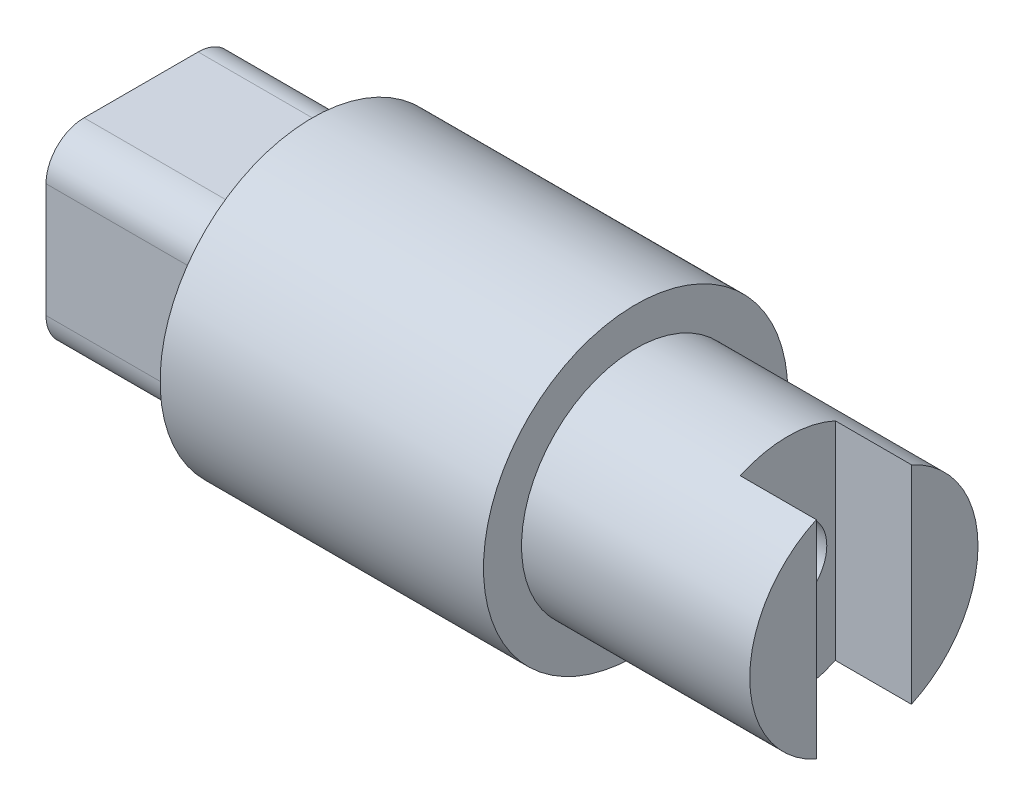
ISO-10303-21;
HEADER;
FILE_DESCRIPTION(('STEP AP214'),'2;1');
FILE_NAME('part.step','',(''),(''),'','','');
FILE_SCHEMA(('AUTOMOTIVE_DESIGN { 1 0 10303 214 1 1 1 1 }'));
ENDSEC;
DATA;
#1=APPLICATION_CONTEXT('core data for automotive mechanical design processes');
#2=APPLICATION_PROTOCOL_DEFINITION('international standard','automotive_design',2000,#1);
#3=PRODUCT_CONTEXT('',#1,'mechanical');
#4=PRODUCT('Part','Part','',(#3));
#5=PRODUCT_RELATED_PRODUCT_CATEGORY('part','',(#4));
#6=PRODUCT_DEFINITION_FORMATION('','',#4);
#7=PRODUCT_DEFINITION_CONTEXT('part definition',#1,'design');
#8=PRODUCT_DEFINITION('design','',#6,#7);
#9=PRODUCT_DEFINITION_SHAPE('','',#8);
#10=(LENGTH_UNIT() NAMED_UNIT(*) SI_UNIT(.MILLI.,.METRE.));
#11=(NAMED_UNIT(*) PLANE_ANGLE_UNIT() SI_UNIT($,.RADIAN.));
#12=(NAMED_UNIT(*) SI_UNIT($,.STERADIAN.) SOLID_ANGLE_UNIT());
#13=UNCERTAINTY_MEASURE_WITH_UNIT(LENGTH_MEASURE(1.E-05),#10,'distance_accuracy_value','');
#14=(GEOMETRIC_REPRESENTATION_CONTEXT(3) GLOBAL_UNCERTAINTY_ASSIGNED_CONTEXT((#13)) GLOBAL_UNIT_ASSIGNED_CONTEXT((#10,
#11,#12)) REPRESENTATION_CONTEXT('',''));
#15=CARTESIAN_POINT('',(0.,0.,0.));
#16=DIRECTION('',(0.,0.,1.));
#17=DIRECTION('',(1.,0.,0.));
#18=AXIS2_PLACEMENT_3D('',#15,#16,#17);
#19=CARTESIAN_POINT('',(19.5,0.,0.));
#20=DIRECTION('',(1.,0.,0.));
#21=DIRECTION('',(0.,0.,-1.));
#22=AXIS2_PLACEMENT_3D('',#19,#20,#21);
#23=PLANE('',#22);
#24=DIRECTION('',(0.,1.,0.));
#25=VECTOR('',#24,1.);
#26=CARTESIAN_POINT('',(19.5,0.,-1.25));
#27=LINE('',#26,#25);
#28=CARTESIAN_POINT('',(19.5,-2.72717802865893,-1.25));
#29=VERTEX_POINT('',#28);
#30=CARTESIAN_POINT('',(19.5,2.72717802865893,-1.25));
#31=VERTEX_POINT('',#30);
#32=EDGE_CURVE('E201',#29,#31,#27,.T.);
#33=ORIENTED_EDGE('',*,*,#32,.F.);
#34=CARTESIAN_POINT('',(19.5,0.,0.));
#35=DIRECTION('',(1.,0.,0.));
#36=DIRECTION('',(0.,0.,-1.));
#37=AXIS2_PLACEMENT_3D('',#34,#35,#36);
#38=CIRCLE('',#37,3.);
#39=EDGE_CURVE('E164',#29,#31,#38,.T.);
#40=ORIENTED_EDGE('',*,*,#39,.T.);
#41=EDGE_LOOP('',(#33,#40));
#42=FACE_BOUND('',#41,.T.);
#43=ADVANCED_FACE('F32',(#42),#23,.T.);
#44=CARTESIAN_POINT('',(13.5,0.,0.));
#45=DIRECTION('',(1.,0.,0.));
#46=DIRECTION('',(0.,0.,-1.));
#47=AXIS2_PLACEMENT_3D('',#44,#45,#46);
#48=PLANE('',#47);
#49=CARTESIAN_POINT('',(13.5,0.,0.));
#50=DIRECTION('',(1.,0.,0.));
#51=DIRECTION('',(0.,0.,-1.));
#52=AXIS2_PLACEMENT_3D('',#49,#50,#51);
#53=CIRCLE('',#52,4.);
#54=CARTESIAN_POINT('',(13.5,0.,-4.));
#55=VERTEX_POINT('',#54);
#56=EDGE_CURVE('E183',#55,#55,#53,.T.);
#57=ORIENTED_EDGE('',*,*,#56,.T.);
#58=EDGE_LOOP('',(#57));
#59=FACE_BOUND('',#58,.T.);
#60=CARTESIAN_POINT('',(13.5,0.,0.));
#61=DIRECTION('',(1.,0.,0.));
#62=DIRECTION('',(0.,0.,-1.));
#63=AXIS2_PLACEMENT_3D('',#60,#61,#62);
#64=CIRCLE('',#63,3.);
#65=CARTESIAN_POINT('',(13.5,0.,-3.));
#66=VERTEX_POINT('',#65);
#67=EDGE_CURVE('E163',#66,#66,#64,.T.);
#68=ORIENTED_EDGE('',*,*,#67,.F.);
#69=EDGE_LOOP('',(#68));
#70=FACE_BOUND('',#69,.T.);
#71=ADVANCED_FACE('F279',(#59,#70),#48,.T.);
#72=CARTESIAN_POINT('',(5.,4.,0.));
#73=DIRECTION('',(-1.,0.,0.));
#74=DIRECTION('',(0.,0.,1.));
#75=AXIS2_PLACEMENT_3D('',#72,#73,#74);
#76=PLANE('',#75);
#77=CARTESIAN_POINT('',(5.,0.,0.));
#78=DIRECTION('',(1.,0.,0.));
#79=DIRECTION('',(0.,0.,-1.));
#80=AXIS2_PLACEMENT_3D('',#77,#78,#79);
#81=CIRCLE('',#80,4.);
#82=CARTESIAN_POINT('',(5.,0.,-4.));
#83=VERTEX_POINT('',#82);
#84=EDGE_CURVE('E196',#83,#83,#81,.T.);
#85=ORIENTED_EDGE('',*,*,#84,.F.);
#86=EDGE_LOOP('',(#85));
#87=FACE_BOUND('',#86,.T.);
#88=DIRECTION('',(0.,0.,-1.));
#89=VECTOR('',#88,1.);
#90=CARTESIAN_POINT('',(5.,2.5,-2.5));
#91=LINE('',#90,#89);
#92=CARTESIAN_POINT('',(5.,2.5,1.5));
#93=VERTEX_POINT('',#92);
#94=CARTESIAN_POINT('',(5.,2.5,-1.5));
#95=VERTEX_POINT('',#94);
#96=EDGE_CURVE('E187',#93,#95,#91,.T.);
#97=ORIENTED_EDGE('',*,*,#96,.F.);
#98=CARTESIAN_POINT('',(5.,1.5,1.5));
#99=DIRECTION('',(-1.,0.,0.));
#100=DIRECTION('',(0.,0.,1.));
#101=AXIS2_PLACEMENT_3D('',#98,#99,#100);
#102=CIRCLE('',#101,1.);
#103=CARTESIAN_POINT('',(5.,1.5,2.5));
#104=VERTEX_POINT('',#103);
#105=EDGE_CURVE('E40',#93,#104,#102,.F.);
#106=ORIENTED_EDGE('',*,*,#105,.T.);
#107=DIRECTION('',(0.,1.,0.));
#108=VECTOR('',#107,1.);
#109=CARTESIAN_POINT('',(5.,-2.5,2.5));
#110=LINE('',#109,#108);
#111=CARTESIAN_POINT('',(5.,-1.5,2.5));
#112=VERTEX_POINT('',#111);
#113=EDGE_CURVE('E184',#112,#104,#110,.T.);
#114=ORIENTED_EDGE('',*,*,#113,.F.);
#115=CARTESIAN_POINT('',(5.,-1.5,1.5));
#116=DIRECTION('',(-1.,0.,0.));
#117=DIRECTION('',(0.,0.,1.));
#118=AXIS2_PLACEMENT_3D('',#115,#116,#117);
#119=CIRCLE('',#118,1.);
#120=CARTESIAN_POINT('',(5.,-2.5,1.5));
#121=VERTEX_POINT('',#120);
#122=EDGE_CURVE('E236',#112,#121,#119,.F.);
#123=ORIENTED_EDGE('',*,*,#122,.T.);
#124=DIRECTION('',(0.,0.,1.));
#125=VECTOR('',#124,1.);
#126=CARTESIAN_POINT('',(5.,-2.5,-2.5));
#127=LINE('',#126,#125);
#128=CARTESIAN_POINT('',(5.,-2.5,-1.5));
#129=VERTEX_POINT('',#128);
#130=EDGE_CURVE('E174',#129,#121,#127,.T.);
#131=ORIENTED_EDGE('',*,*,#130,.F.);
#132=CARTESIAN_POINT('',(5.,-1.5,-1.5));
#133=DIRECTION('',(-1.,0.,0.));
#134=DIRECTION('',(0.,0.,1.));
#135=AXIS2_PLACEMENT_3D('',#132,#133,#134);
#136=CIRCLE('',#135,1.);
#137=CARTESIAN_POINT('',(5.,-1.5,-2.5));
#138=VERTEX_POINT('',#137);
#139=EDGE_CURVE('E234',#129,#138,#136,.F.);
#140=ORIENTED_EDGE('',*,*,#139,.T.);
#141=DIRECTION('',(0.,-1.,0.));
#142=VECTOR('',#141,1.);
#143=CARTESIAN_POINT('',(5.,-2.5,-2.5));
#144=LINE('',#143,#142);
#145=CARTESIAN_POINT('',(5.,1.5,-2.5));
#146=VERTEX_POINT('',#145);
#147=EDGE_CURVE('E189',#146,#138,#144,.T.);
#148=ORIENTED_EDGE('',*,*,#147,.F.);
#149=CARTESIAN_POINT('',(5.,1.5,-1.5));
#150=DIRECTION('',(-1.,0.,0.));
#151=DIRECTION('',(0.,0.,1.));
#152=AXIS2_PLACEMENT_3D('',#149,#150,#151);
#153=CIRCLE('',#152,1.);
#154=EDGE_CURVE('E11',#146,#95,#153,.F.);
#155=ORIENTED_EDGE('',*,*,#154,.T.);
#156=EDGE_LOOP('',(#97,#106,#114,#123,#131,#140,#148,#155));
#157=FACE_BOUND('',#156,.T.);
#158=ADVANCED_FACE('F238',(#87,#157),#76,.T.);
#159=CARTESIAN_POINT('',(5.,0.,0.));
#160=DIRECTION('',(1.,0.,0.));
#161=DIRECTION('',(0.,0.,-1.));
#162=AXIS2_PLACEMENT_3D('',#159,#160,#161);
#163=CYLINDRICAL_SURFACE('',#162,4.);
#164=ORIENTED_EDGE('',*,*,#84,.T.);
#165=EDGE_LOOP('',(#164));
#166=FACE_BOUND('',#165,.T.);
#167=ORIENTED_EDGE('',*,*,#56,.F.);
#168=EDGE_LOOP('',(#167));
#169=FACE_BOUND('',#168,.T.);
#170=ADVANCED_FACE('F401',(#166,#169),#163,.T.);
#171=CARTESIAN_POINT('',(0.5,-2.5,2.5));
#172=DIRECTION('',(0.,0.,-1.));
#173=DIRECTION('',(-1.,0.,0.));
#174=AXIS2_PLACEMENT_3D('',#171,#172,#173);
#175=PLANE('',#174);
#176=DIRECTION('',(0.,1.,0.));
#177=VECTOR('',#176,1.);
#178=CARTESIAN_POINT('',(0.5,-2.5,2.5));
#179=LINE('',#178,#177);
#180=CARTESIAN_POINT('',(0.5,-1.5,2.5));
#181=VERTEX_POINT('',#180);
#182=CARTESIAN_POINT('',(0.5,1.5,2.5));
#183=VERTEX_POINT('',#182);
#184=EDGE_CURVE('E170',#181,#183,#179,.T.);
#185=ORIENTED_EDGE('',*,*,#184,.F.);
#186=DIRECTION('',(1.,0.,0.));
#187=VECTOR('',#186,1.);
#188=CARTESIAN_POINT('',(0.5,-1.5,2.5));
#189=LINE('',#188,#187);
#190=EDGE_CURVE('E227',#181,#112,#189,.T.);
#191=ORIENTED_EDGE('',*,*,#190,.T.);
#192=ORIENTED_EDGE('',*,*,#113,.T.);
#193=DIRECTION('',(1.,0.,0.));
#194=VECTOR('',#193,1.);
#195=CARTESIAN_POINT('',(0.5,1.5,2.5));
#196=LINE('',#195,#194);
#197=EDGE_CURVE('E225',#104,#183,#196,.F.);
#198=ORIENTED_EDGE('',*,*,#197,.T.);
#199=EDGE_LOOP('',(#185,#191,#192,#198));
#200=FACE_BOUND('',#199,.T.);
#201=ADVANCED_FACE('F241',(#200),#175,.F.);
#202=CARTESIAN_POINT('',(0.5,2.5,-2.5));
#203=DIRECTION('',(0.,-1.,0.));
#204=DIRECTION('',(0.,0.,-1.));
#205=AXIS2_PLACEMENT_3D('',#202,#203,#204);
#206=PLANE('',#205);
#207=DIRECTION('',(0.,0.,-1.));
#208=VECTOR('',#207,1.);
#209=CARTESIAN_POINT('',(0.5,2.5,-2.5));
#210=LINE('',#209,#208);
#211=CARTESIAN_POINT('',(0.5,2.5,1.5));
#212=VERTEX_POINT('',#211);
#213=CARTESIAN_POINT('',(0.5,2.5,-1.5));
#214=VERTEX_POINT('',#213);
#215=EDGE_CURVE('E173',#212,#214,#210,.T.);
#216=ORIENTED_EDGE('',*,*,#215,.F.);
#217=DIRECTION('',(1.,0.,0.));
#218=VECTOR('',#217,1.);
#219=CARTESIAN_POINT('',(0.5,2.5,1.5));
#220=LINE('',#219,#218);
#221=EDGE_CURVE('E232',#212,#93,#220,.T.);
#222=ORIENTED_EDGE('',*,*,#221,.T.);
#223=ORIENTED_EDGE('',*,*,#96,.T.);
#224=DIRECTION('',(1.,0.,0.));
#225=VECTOR('',#224,1.);
#226=CARTESIAN_POINT('',(0.5,2.5,-1.5));
#227=LINE('',#226,#225);
#228=EDGE_CURVE('E230',#95,#214,#227,.F.);
#229=ORIENTED_EDGE('',*,*,#228,.T.);
#230=EDGE_LOOP('',(#216,#222,#223,#229));
#231=FACE_BOUND('',#230,.T.);
#232=ADVANCED_FACE('F250',(#231),#206,.F.);
#233=CARTESIAN_POINT('',(0.5,-2.5,-2.5));
#234=DIRECTION('',(0.,0.,1.));
#235=DIRECTION('',(1.,0.,0.));
#236=AXIS2_PLACEMENT_3D('',#233,#234,#235);
#237=PLANE('',#236);
#238=ORIENTED_EDGE('',*,*,#147,.T.);
#239=DIRECTION('',(1.,0.,0.));
#240=VECTOR('',#239,1.);
#241=CARTESIAN_POINT('',(0.5,-1.5,-2.5));
#242=LINE('',#241,#240);
#243=CARTESIAN_POINT('',(0.5,-1.5,-2.5));
#244=VERTEX_POINT('',#243);
#245=EDGE_CURVE('E215',#138,#244,#242,.F.);
#246=ORIENTED_EDGE('',*,*,#245,.T.);
#247=DIRECTION('',(0.,-1.,0.));
#248=VECTOR('',#247,1.);
#249=CARTESIAN_POINT('',(0.5,-2.5,-2.5));
#250=LINE('',#249,#248);
#251=CARTESIAN_POINT('',(0.5,1.5,-2.5));
#252=VERTEX_POINT('',#251);
#253=EDGE_CURVE('E177',#252,#244,#250,.T.);
#254=ORIENTED_EDGE('',*,*,#253,.F.);
#255=DIRECTION('',(1.,0.,0.));
#256=VECTOR('',#255,1.);
#257=CARTESIAN_POINT('',(0.5,1.5,-2.5));
#258=LINE('',#257,#256);
#259=EDGE_CURVE('E212',#252,#146,#258,.T.);
#260=ORIENTED_EDGE('',*,*,#259,.T.);
#261=EDGE_LOOP('',(#238,#246,#254,#260));
#262=FACE_BOUND('',#261,.T.);
#263=ADVANCED_FACE('F257',(#262),#237,.F.);
#264=CARTESIAN_POINT('',(0.5,-2.5,-2.5));
#265=DIRECTION('',(0.,1.,0.));
#266=DIRECTION('',(0.,0.,1.));
#267=AXIS2_PLACEMENT_3D('',#264,#265,#266);
#268=PLANE('',#267);
#269=DIRECTION('',(0.,0.,1.));
#270=VECTOR('',#269,1.);
#271=CARTESIAN_POINT('',(0.5,-2.5,-2.5));
#272=LINE('',#271,#270);
#273=CARTESIAN_POINT('',(0.5,-2.5,-1.5));
#274=VERTEX_POINT('',#273);
#275=CARTESIAN_POINT('',(0.5,-2.5,1.5));
#276=VERTEX_POINT('',#275);
#277=EDGE_CURVE('E180',#274,#276,#272,.T.);
#278=ORIENTED_EDGE('',*,*,#277,.F.);
#279=DIRECTION('',(1.,0.,0.));
#280=VECTOR('',#279,1.);
#281=CARTESIAN_POINT('',(0.5,-2.5,-1.5));
#282=LINE('',#281,#280);
#283=EDGE_CURVE('E209',#274,#129,#282,.T.);
#284=ORIENTED_EDGE('',*,*,#283,.T.);
#285=ORIENTED_EDGE('',*,*,#130,.T.);
#286=DIRECTION('',(1.,0.,0.));
#287=VECTOR('',#286,1.);
#288=CARTESIAN_POINT('',(0.5,-2.5,1.5));
#289=LINE('',#288,#287);
#290=EDGE_CURVE('E207',#121,#276,#289,.F.);
#291=ORIENTED_EDGE('',*,*,#290,.T.);
#292=EDGE_LOOP('',(#278,#284,#285,#291));
#293=FACE_BOUND('',#292,.T.);
#294=ADVANCED_FACE('F265',(#293),#268,.F.);
#295=CARTESIAN_POINT('',(0.5,0.,0.));
#296=DIRECTION('',(1.,0.,0.));
#297=DIRECTION('',(0.,0.,-1.));
#298=AXIS2_PLACEMENT_3D('',#295,#296,#297);
#299=PLANE('',#298);
#300=CARTESIAN_POINT('',(0.499999999999999,0.,0.));
#301=DIRECTION('',(-1.,0.,0.));
#302=DIRECTION('',(0.,0.,1.));
#303=AXIS2_PLACEMENT_3D('',#300,#301,#302);
#304=CIRCLE('',#303,1.24999999999999);
#305=CARTESIAN_POINT('',(0.499999999999999,0.,1.24999999999999));
#306=VERTEX_POINT('',#305);
#307=EDGE_CURVE('E134',#306,#306,#304,.T.);
#308=ORIENTED_EDGE('',*,*,#307,.F.);
#309=EDGE_LOOP('',(#308));
#310=FACE_BOUND('',#309,.T.);
#311=ORIENTED_EDGE('',*,*,#253,.T.);
#312=CARTESIAN_POINT('',(0.5,-1.5,-1.5));
#313=DIRECTION('',(1.,0.,0.));
#314=DIRECTION('',(0.,0.,-1.));
#315=AXIS2_PLACEMENT_3D('',#312,#313,#314);
#316=CIRCLE('',#315,1.);
#317=EDGE_CURVE('E223',#244,#274,#316,.F.);
#318=ORIENTED_EDGE('',*,*,#317,.T.);
#319=ORIENTED_EDGE('',*,*,#277,.T.);
#320=CARTESIAN_POINT('',(0.5,-1.5,1.5));
#321=DIRECTION('',(1.,0.,0.));
#322=DIRECTION('',(0.,0.,-1.));
#323=AXIS2_PLACEMENT_3D('',#320,#321,#322);
#324=CIRCLE('',#323,1.);
#325=EDGE_CURVE('E221',#276,#181,#324,.F.);
#326=ORIENTED_EDGE('',*,*,#325,.T.);
#327=ORIENTED_EDGE('',*,*,#184,.T.);
#328=CARTESIAN_POINT('',(0.5,1.5,1.5));
#329=DIRECTION('',(1.,0.,0.));
#330=DIRECTION('',(0.,0.,-1.));
#331=AXIS2_PLACEMENT_3D('',#328,#329,#330);
#332=CIRCLE('',#331,1.);
#333=EDGE_CURVE('E219',#183,#212,#332,.F.);
#334=ORIENTED_EDGE('',*,*,#333,.T.);
#335=ORIENTED_EDGE('',*,*,#215,.T.);
#336=CARTESIAN_POINT('',(0.5,1.5,-1.5));
#337=DIRECTION('',(1.,0.,0.));
#338=DIRECTION('',(0.,0.,-1.));
#339=AXIS2_PLACEMENT_3D('',#336,#337,#338);
#340=CIRCLE('',#339,1.);
#341=EDGE_CURVE('E217',#214,#252,#340,.F.);
#342=ORIENTED_EDGE('',*,*,#341,.T.);
#343=EDGE_LOOP('',(#311,#318,#319,#326,#327,#334,#335,#342));
#344=FACE_BOUND('',#343,.T.);
#345=ADVANCED_FACE('F247',(#310,#344),#299,.F.);
#346=CARTESIAN_POINT('',(19.5,0.,0.));
#347=DIRECTION('',(-1.,0.,0.));
#348=DIRECTION('',(0.,0.,1.));
#349=AXIS2_PLACEMENT_3D('',#346,#347,#348);
#350=CYLINDRICAL_SURFACE('',#349,3.);
#351=CARTESIAN_POINT('',(17.5,0.,0.));
#352=DIRECTION('',(-1.,0.,0.));
#353=DIRECTION('',(0.,0.,1.));
#354=AXIS2_PLACEMENT_3D('',#351,#352,#353);
#355=CIRCLE('',#354,3.);
#356=CARTESIAN_POINT('',(17.5,2.72717802865893,1.25));
#357=VERTEX_POINT('',#356);
#358=CARTESIAN_POINT('',(17.5,2.72717802865893,-1.25));
#359=VERTEX_POINT('',#358);
#360=EDGE_CURVE('E206',#357,#359,#355,.T.);
#361=ORIENTED_EDGE('',*,*,#360,.T.);
#362=DIRECTION('',(-1.,0.,0.));
#363=VECTOR('',#362,1.);
#364=CARTESIAN_POINT('',(19.5,2.72717802865893,-1.25));
#365=LINE('',#364,#363);
#366=EDGE_CURVE('E157',#359,#31,#365,.F.);
#367=ORIENTED_EDGE('',*,*,#366,.T.);
#368=ORIENTED_EDGE('',*,*,#39,.F.);
#369=DIRECTION('',(-1.,0.,0.));
#370=VECTOR('',#369,1.);
#371=CARTESIAN_POINT('',(19.5,-2.72717802865893,-1.25));
#372=LINE('',#371,#370);
#373=CARTESIAN_POINT('',(17.5,-2.72717802865893,-1.25));
#374=VERTEX_POINT('',#373);
#375=EDGE_CURVE('E160',#29,#374,#372,.T.);
#376=ORIENTED_EDGE('',*,*,#375,.T.);
#377=CARTESIAN_POINT('',(17.5,-2.72717802865893,1.25));
#378=VERTEX_POINT('',#377);
#379=EDGE_CURVE('E203',#374,#378,#355,.T.);
#380=ORIENTED_EDGE('',*,*,#379,.T.);
#381=DIRECTION('',(-1.,0.,0.));
#382=VECTOR('',#381,1.);
#383=CARTESIAN_POINT('',(19.5,-2.72717802865893,1.25));
#384=LINE('',#383,#382);
#385=CARTESIAN_POINT('',(19.5,-2.72717802865893,1.25));
#386=VERTEX_POINT('',#385);
#387=EDGE_CURVE('E151',#378,#386,#384,.F.);
#388=ORIENTED_EDGE('',*,*,#387,.T.);
#389=CARTESIAN_POINT('',(19.5,2.72717802865893,1.25));
#390=VERTEX_POINT('',#389);
#391=EDGE_CURVE('E167',#390,#386,#38,.T.);
#392=ORIENTED_EDGE('',*,*,#391,.F.);
#393=DIRECTION('',(-1.,0.,0.));
#394=VECTOR('',#393,1.);
#395=CARTESIAN_POINT('',(19.5,2.72717802865893,1.25));
#396=LINE('',#395,#394);
#397=EDGE_CURVE('E154',#390,#357,#396,.T.);
#398=ORIENTED_EDGE('',*,*,#397,.T.);
#399=EDGE_LOOP('',(#361,#367,#368,#376,#380,#388,#392,#398));
#400=FACE_BOUND('',#399,.T.);
#401=ORIENTED_EDGE('',*,*,#67,.T.);
#402=EDGE_LOOP('',(#401));
#403=FACE_BOUND('',#402,.T.);
#404=ADVANCED_FACE('F293',(#400,#403),#350,.T.);
#405=DIRECTION('',(0.,-1.,0.));
#406=VECTOR('',#405,1.);
#407=CARTESIAN_POINT('',(19.5,0.,1.25));
#408=LINE('',#407,#406);
#409=EDGE_CURVE('E199',#390,#386,#408,.T.);
#410=ORIENTED_EDGE('',*,*,#409,.F.);
#411=ORIENTED_EDGE('',*,*,#391,.T.);
#412=EDGE_LOOP('',(#410,#411));
#413=FACE_BOUND('',#412,.T.);
#414=ADVANCED_FACE('F282',(#413),#23,.T.);
#415=CARTESIAN_POINT('',(17.5,0.,0.));
#416=DIRECTION('',(-1.,0.,0.));
#417=DIRECTION('',(0.,0.,1.));
#418=AXIS2_PLACEMENT_3D('',#415,#416,#417);
#419=PLANE('',#418);
#420=CARTESIAN_POINT('',(17.5,0.,0.));
#421=DIRECTION('',(1.,0.,0.));
#422=DIRECTION('',(0.,0.,-1.));
#423=AXIS2_PLACEMENT_3D('',#420,#421,#422);
#424=CIRCLE('',#423,1.025);
#425=CARTESIAN_POINT('',(17.5,0.,-1.025));
#426=VERTEX_POINT('',#425);
#427=EDGE_CURVE('E135',#426,#426,#424,.T.);
#428=ORIENTED_EDGE('',*,*,#427,.F.);
#429=EDGE_LOOP('',(#428));
#430=FACE_BOUND('',#429,.T.);
#431=DIRECTION('',(0.,-1.,0.));
#432=VECTOR('',#431,1.);
#433=CARTESIAN_POINT('',(17.5,-3.41987152606756,1.25));
#434=LINE('',#433,#432);
#435=EDGE_CURVE('E148',#357,#378,#434,.T.);
#436=ORIENTED_EDGE('',*,*,#435,.T.);
#437=ORIENTED_EDGE('',*,*,#379,.F.);
#438=DIRECTION('',(0.,1.,0.));
#439=VECTOR('',#438,1.);
#440=CARTESIAN_POINT('',(17.5,-3.41987152606756,-1.25));
#441=LINE('',#440,#439);
#442=EDGE_CURVE('E145',#374,#359,#441,.T.);
#443=ORIENTED_EDGE('',*,*,#442,.T.);
#444=ORIENTED_EDGE('',*,*,#360,.F.);
#445=EDGE_LOOP('',(#436,#437,#443,#444));
#446=FACE_BOUND('',#445,.T.);
#447=ADVANCED_FACE('F292',(#430,#446),#419,.F.);
#448=CARTESIAN_POINT('',(17.5,-3.41987152606756,-1.25));
#449=DIRECTION('',(0.,0.,-1.));
#450=DIRECTION('',(-1.,0.,0.));
#451=AXIS2_PLACEMENT_3D('',#448,#449,#450);
#452=PLANE('',#451);
#453=ORIENTED_EDGE('',*,*,#32,.T.);
#454=ORIENTED_EDGE('',*,*,#366,.F.);
#455=ORIENTED_EDGE('',*,*,#442,.F.);
#456=ORIENTED_EDGE('',*,*,#375,.F.);
#457=EDGE_LOOP('',(#453,#454,#455,#456));
#458=FACE_BOUND('',#457,.T.);
#459=ADVANCED_FACE('F299',(#458),#452,.F.);
#460=CARTESIAN_POINT('',(17.5,-3.41987152606756,1.25));
#461=DIRECTION('',(0.,0.,1.));
#462=DIRECTION('',(1.,0.,0.));
#463=AXIS2_PLACEMENT_3D('',#460,#461,#462);
#464=PLANE('',#463);
#465=ORIENTED_EDGE('',*,*,#409,.T.);
#466=ORIENTED_EDGE('',*,*,#387,.F.);
#467=ORIENTED_EDGE('',*,*,#435,.F.);
#468=ORIENTED_EDGE('',*,*,#397,.F.);
#469=EDGE_LOOP('',(#465,#466,#467,#468));
#470=FACE_BOUND('',#469,.T.);
#471=ADVANCED_FACE('F276',(#470),#464,.F.);
#472=CARTESIAN_POINT('',(0.5,-1.5,-1.5));
#473=DIRECTION('',(1.,0.,0.));
#474=DIRECTION('',(0.,0.,-1.));
#475=AXIS2_PLACEMENT_3D('',#472,#473,#474);
#476=CYLINDRICAL_SURFACE('',#475,1.);
#477=ORIENTED_EDGE('',*,*,#317,.F.);
#478=ORIENTED_EDGE('',*,*,#245,.F.);
#479=ORIENTED_EDGE('',*,*,#139,.F.);
#480=ORIENTED_EDGE('',*,*,#283,.F.);
#481=EDGE_LOOP('',(#477,#478,#479,#480));
#482=FACE_BOUND('',#481,.T.);
#483=ADVANCED_FACE('F260',(#482),#476,.T.);
#484=CARTESIAN_POINT('',(0.5,-1.5,1.5));
#485=DIRECTION('',(1.,0.,0.));
#486=DIRECTION('',(0.,0.,-1.));
#487=AXIS2_PLACEMENT_3D('',#484,#485,#486);
#488=CYLINDRICAL_SURFACE('',#487,1.);
#489=ORIENTED_EDGE('',*,*,#325,.F.);
#490=ORIENTED_EDGE('',*,*,#290,.F.);
#491=ORIENTED_EDGE('',*,*,#122,.F.);
#492=ORIENTED_EDGE('',*,*,#190,.F.);
#493=EDGE_LOOP('',(#489,#490,#491,#492));
#494=FACE_BOUND('',#493,.T.);
#495=ADVANCED_FACE('F269',(#494),#488,.T.);
#496=CARTESIAN_POINT('',(0.5,1.5,1.5));
#497=DIRECTION('',(1.,0.,0.));
#498=DIRECTION('',(0.,0.,-1.));
#499=AXIS2_PLACEMENT_3D('',#496,#497,#498);
#500=CYLINDRICAL_SURFACE('',#499,1.);
#501=ORIENTED_EDGE('',*,*,#333,.F.);
#502=ORIENTED_EDGE('',*,*,#197,.F.);
#503=ORIENTED_EDGE('',*,*,#105,.F.);
#504=ORIENTED_EDGE('',*,*,#221,.F.);
#505=EDGE_LOOP('',(#501,#502,#503,#504));
#506=FACE_BOUND('',#505,.T.);
#507=ADVANCED_FACE('F244',(#506),#500,.T.);
#508=CARTESIAN_POINT('',(0.5,1.5,-1.5));
#509=DIRECTION('',(1.,0.,0.));
#510=DIRECTION('',(0.,0.,-1.));
#511=AXIS2_PLACEMENT_3D('',#508,#509,#510);
#512=CYLINDRICAL_SURFACE('',#511,1.);
#513=ORIENTED_EDGE('',*,*,#341,.F.);
#514=ORIENTED_EDGE('',*,*,#228,.F.);
#515=ORIENTED_EDGE('',*,*,#154,.F.);
#516=ORIENTED_EDGE('',*,*,#259,.F.);
#517=EDGE_LOOP('',(#513,#514,#515,#516));
#518=FACE_BOUND('',#517,.T.);
#519=ADVANCED_FACE('F34',(#518),#512,.T.);
#520=CARTESIAN_POINT('',(8.,0.,0.));
#521=DIRECTION('',(-1.,0.,0.));
#522=DIRECTION('',(0.,0.,1.));
#523=AXIS2_PLACEMENT_3D('',#520,#521,#522);
#524=CONICAL_SURFACE('',#523,1.25,1.02974425867665);
#525=CARTESIAN_POINT('',(8.75107577378445,0.,0.));
#526=VERTEX_POINT('',#525);
#527=VERTEX_LOOP('',#526);
#528=FACE_BOUND('',#527,.T.);
#529=CARTESIAN_POINT('',(8.,0.,0.));
#530=DIRECTION('',(-1.,0.,0.));
#531=DIRECTION('',(0.,0.,1.));
#532=AXIS2_PLACEMENT_3D('',#529,#530,#531);
#533=CIRCLE('',#532,1.25);
#534=CARTESIAN_POINT('',(8.,0.,1.25));
#535=VERTEX_POINT('',#534);
#536=EDGE_CURVE('E138',#535,#535,#533,.T.);
#537=ORIENTED_EDGE('',*,*,#536,.T.);
#538=EDGE_LOOP('',(#537));
#539=FACE_BOUND('',#538,.T.);
#540=ADVANCED_FACE('F320',(#528,#539),#524,.F.);
#541=CARTESIAN_POINT('',(0.5,0.,0.));
#542=DIRECTION('',(-1.,0.,0.));
#543=DIRECTION('',(0.,0.,1.));
#544=AXIS2_PLACEMENT_3D('',#541,#542,#543);
#545=CYLINDRICAL_SURFACE('',#544,1.24999999999999);
#546=ORIENTED_EDGE('',*,*,#536,.F.);
#547=EDGE_LOOP('',(#546));
#548=FACE_BOUND('',#547,.T.);
#549=ORIENTED_EDGE('',*,*,#307,.T.);
#550=EDGE_LOOP('',(#549));
#551=FACE_BOUND('',#550,.T.);
#552=ADVANCED_FACE('F128',(#548,#551),#545,.F.);
#553=CARTESIAN_POINT('',(12.5,0.,0.));
#554=DIRECTION('',(1.,0.,0.));
#555=DIRECTION('',(0.,0.,-1.));
#556=AXIS2_PLACEMENT_3D('',#553,#554,#555);
#557=CONICAL_SURFACE('',#556,1.025,1.02974425867665);
#558=CARTESIAN_POINT('',(11.8841178654968,0.,0.));
#559=VERTEX_POINT('',#558);
#560=VERTEX_LOOP('',#559);
#561=FACE_BOUND('',#560,.T.);
#562=CARTESIAN_POINT('',(12.5,0.,0.));
#563=DIRECTION('',(1.,0.,0.));
#564=DIRECTION('',(0.,0.,-1.));
#565=AXIS2_PLACEMENT_3D('',#562,#563,#564);
#566=CIRCLE('',#565,1.025);
#567=CARTESIAN_POINT('',(12.5,0.,-1.025));
#568=VERTEX_POINT('',#567);
#569=EDGE_CURVE('E132',#568,#568,#566,.T.);
#570=ORIENTED_EDGE('',*,*,#569,.T.);
#571=EDGE_LOOP('',(#570));
#572=FACE_BOUND('',#571,.T.);
#573=ADVANCED_FACE('F124',(#561,#572),#557,.F.);
#574=CARTESIAN_POINT('',(17.5,0.,0.));
#575=DIRECTION('',(1.,0.,0.));
#576=DIRECTION('',(0.,0.,-1.));
#577=AXIS2_PLACEMENT_3D('',#574,#575,#576);
#578=CYLINDRICAL_SURFACE('',#577,1.025);
#579=ORIENTED_EDGE('',*,*,#569,.F.);
#580=EDGE_LOOP('',(#579));
#581=FACE_BOUND('',#580,.T.);
#582=ORIENTED_EDGE('',*,*,#427,.T.);
#583=EDGE_LOOP('',(#582));
#584=FACE_BOUND('',#583,.T.);
#585=ADVANCED_FACE('F127',(#581,#584),#578,.F.);
#586=CLOSED_SHELL('',(#43,#71,#158,#170,#201,#232,#263,#294,#345,#404,#414,#447,#459,#471,#483,
#495,#507,#519,#540,#552,#573,#585));
#587=MANIFOLD_SOLID_BREP('B2',#586);
#588=ADVANCED_BREP_SHAPE_REPRESENTATION('',(#18,#587),#14);
#589=SHAPE_DEFINITION_REPRESENTATION(#9,#588);
ENDSEC;
END-ISO-10303-21;
